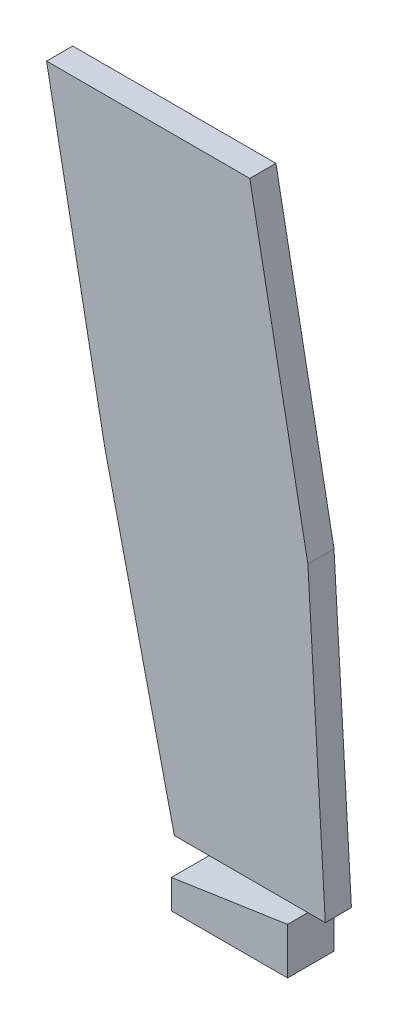
ISO-10303-21;
HEADER;
FILE_DESCRIPTION(('STEP AP214'),'2;1');
FILE_NAME('part.step','',(''),(''),'','','');
FILE_SCHEMA(('AUTOMOTIVE_DESIGN { 1 0 10303 214 1 1 1 1 }'));
ENDSEC;
DATA;
#1=APPLICATION_CONTEXT('core data for automotive mechanical design processes');
#2=APPLICATION_PROTOCOL_DEFINITION('international standard','automotive_design',2000,#1);
#3=PRODUCT_CONTEXT('',#1,'mechanical');
#4=PRODUCT('Part','Part','',(#3));
#5=PRODUCT_RELATED_PRODUCT_CATEGORY('part','',(#4));
#6=PRODUCT_DEFINITION_FORMATION('','',#4);
#7=PRODUCT_DEFINITION_CONTEXT('part definition',#1,'design');
#8=PRODUCT_DEFINITION('design','',#6,#7);
#9=PRODUCT_DEFINITION_SHAPE('','',#8);
#10=(LENGTH_UNIT() NAMED_UNIT(*) SI_UNIT(.MILLI.,.METRE.));
#11=(NAMED_UNIT(*) PLANE_ANGLE_UNIT() SI_UNIT($,.RADIAN.));
#12=(NAMED_UNIT(*) SI_UNIT($,.STERADIAN.) SOLID_ANGLE_UNIT());
#13=UNCERTAINTY_MEASURE_WITH_UNIT(LENGTH_MEASURE(1.E-05),#10,'distance_accuracy_value','');
#14=(GEOMETRIC_REPRESENTATION_CONTEXT(3) GLOBAL_UNCERTAINTY_ASSIGNED_CONTEXT((#13)) GLOBAL_UNIT_ASSIGNED_CONTEXT((#10,
#11,#12)) REPRESENTATION_CONTEXT('',''));
#15=CARTESIAN_POINT('',(0.,0.,0.));
#16=DIRECTION('',(0.,0.,1.));
#17=DIRECTION('',(1.,0.,0.));
#18=AXIS2_PLACEMENT_3D('',#15,#16,#17);
#19=CARTESIAN_POINT('',(1180.,580.,45.));
#20=DIRECTION('',(0.,1.,0.));
#21=DIRECTION('',(0.,0.,1.));
#22=AXIS2_PLACEMENT_3D('',#19,#20,#21);
#23=PLANE('',#22);
#24=DIRECTION('',(1.,0.,0.));
#25=VECTOR('',#24,1.);
#26=CARTESIAN_POINT('',(1180.,580.,0.));
#27=LINE('',#26,#25);
#28=CARTESIAN_POINT('',(920.,580.,0.));
#29=VERTEX_POINT('',#28);
#30=CARTESIAN_POINT('',(1180.,580.,0.));
#31=VERTEX_POINT('',#30);
#32=EDGE_CURVE('E133',#29,#31,#27,.T.);
#33=ORIENTED_EDGE('',*,*,#32,.T.);
#34=DIRECTION('',(0.,0.,-1.));
#35=VECTOR('',#34,1.);
#36=CARTESIAN_POINT('',(1180.,580.,45.));
#37=LINE('',#36,#35);
#38=CARTESIAN_POINT('',(1180.,580.,45.));
#39=VERTEX_POINT('',#38);
#40=EDGE_CURVE('E12',#39,#31,#37,.T.);
#41=ORIENTED_EDGE('',*,*,#40,.F.);
#42=DIRECTION('',(1.,0.,0.));
#43=VECTOR('',#42,1.);
#44=CARTESIAN_POINT('',(1180.,580.,45.));
#45=LINE('',#44,#43);
#46=CARTESIAN_POINT('',(920.,580.,45.));
#47=VERTEX_POINT('',#46);
#48=EDGE_CURVE('E142',#47,#39,#45,.T.);
#49=ORIENTED_EDGE('',*,*,#48,.F.);
#50=DIRECTION('',(0.,0.,-1.));
#51=VECTOR('',#50,1.);
#52=CARTESIAN_POINT('',(920.,580.,45.));
#53=LINE('',#52,#51);
#54=EDGE_CURVE('E129',#47,#29,#53,.T.);
#55=ORIENTED_EDGE('',*,*,#54,.T.);
#56=EDGE_LOOP('',(#33,#41,#49,#55));
#57=FACE_BOUND('',#56,.T.);
#58=ADVANCED_FACE('F47',(#57),#23,.F.);
#59=CARTESIAN_POINT('',(1150.,1100.,45.));
#60=DIRECTION('',(-0.998339941675609,-0.0575965350966698,0.));
#61=DIRECTION('',(0.0575965350966698,-0.998339941675609,0.));
#62=AXIS2_PLACEMENT_3D('',#59,#60,#61);
#63=PLANE('',#62);
#64=DIRECTION('',(-0.0575965350966698,0.998339941675609,0.));
#65=VECTOR('',#64,1.);
#66=CARTESIAN_POINT('',(1150.,1100.,0.));
#67=LINE('',#66,#65);
#68=CARTESIAN_POINT('',(1150.,1100.,0.));
#69=VERTEX_POINT('',#68);
#70=EDGE_CURVE('E136',#31,#69,#67,.T.);
#71=ORIENTED_EDGE('',*,*,#70,.T.);
#72=DIRECTION('',(0.,0.,-1.));
#73=VECTOR('',#72,1.);
#74=CARTESIAN_POINT('',(1150.,1100.,45.));
#75=LINE('',#74,#73);
#76=CARTESIAN_POINT('',(1150.,1100.,45.));
#77=VERTEX_POINT('',#76);
#78=EDGE_CURVE('E60',#77,#69,#75,.T.);
#79=ORIENTED_EDGE('',*,*,#78,.F.);
#80=DIRECTION('',(-0.0575965350966698,0.998339941675609,0.));
#81=VECTOR('',#80,1.);
#82=CARTESIAN_POINT('',(1150.,1100.,45.));
#83=LINE('',#82,#81);
#84=EDGE_CURVE('E105',#39,#77,#83,.T.);
#85=ORIENTED_EDGE('',*,*,#84,.F.);
#86=ORIENTED_EDGE('',*,*,#40,.T.);
#87=EDGE_LOOP('',(#71,#79,#85,#86));
#88=FACE_BOUND('',#87,.T.);
#89=ADVANCED_FACE('F167',(#88),#63,.F.);
#90=CARTESIAN_POINT('',(1050.,1625.,45.));
#91=DIRECTION('',(-0.982338566422475,-0.187112107889995,0.));
#92=DIRECTION('',(0.187112107889995,-0.982338566422475,0.));
#93=AXIS2_PLACEMENT_3D('',#90,#91,#92);
#94=PLANE('',#93);
#95=DIRECTION('',(-0.187112107889995,0.982338566422475,0.));
#96=VECTOR('',#95,1.);
#97=CARTESIAN_POINT('',(1050.,1625.,0.));
#98=LINE('',#97,#96);
#99=CARTESIAN_POINT('',(1050.,1625.,0.));
#100=VERTEX_POINT('',#99);
#101=EDGE_CURVE('E138',#69,#100,#98,.T.);
#102=ORIENTED_EDGE('',*,*,#101,.T.);
#103=DIRECTION('',(0.,0.,-1.));
#104=VECTOR('',#103,1.);
#105=CARTESIAN_POINT('',(1050.,1625.,45.));
#106=LINE('',#105,#104);
#107=CARTESIAN_POINT('',(1050.,1625.,45.));
#108=VERTEX_POINT('',#107);
#109=EDGE_CURVE('E125',#108,#100,#106,.T.);
#110=ORIENTED_EDGE('',*,*,#109,.F.);
#111=DIRECTION('',(-0.187112107889995,0.982338566422475,0.));
#112=VECTOR('',#111,1.);
#113=CARTESIAN_POINT('',(1050.,1625.,45.));
#114=LINE('',#113,#112);
#115=EDGE_CURVE('E113',#77,#108,#114,.T.);
#116=ORIENTED_EDGE('',*,*,#115,.F.);
#117=ORIENTED_EDGE('',*,*,#78,.T.);
#118=EDGE_LOOP('',(#102,#110,#116,#117));
#119=FACE_BOUND('',#118,.T.);
#120=ADVANCED_FACE('F146',(#119),#94,.F.);
#121=CARTESIAN_POINT('',(700.,1625.,45.));
#122=DIRECTION('',(0.,-1.,0.));
#123=DIRECTION('',(0.,0.,-1.));
#124=AXIS2_PLACEMENT_3D('',#121,#122,#123);
#125=PLANE('',#124);
#126=DIRECTION('',(-1.,0.,0.));
#127=VECTOR('',#126,1.);
#128=CARTESIAN_POINT('',(700.,1625.,0.));
#129=LINE('',#128,#127);
#130=CARTESIAN_POINT('',(700.,1625.,0.));
#131=VERTEX_POINT('',#130);
#132=EDGE_CURVE('E121',#100,#131,#129,.T.);
#133=ORIENTED_EDGE('',*,*,#132,.T.);
#134=DIRECTION('',(0.,0.,-1.));
#135=VECTOR('',#134,1.);
#136=CARTESIAN_POINT('',(700.,1625.,45.));
#137=LINE('',#136,#135);
#138=CARTESIAN_POINT('',(700.,1625.,45.));
#139=VERTEX_POINT('',#138);
#140=EDGE_CURVE('E119',#139,#131,#137,.T.);
#141=ORIENTED_EDGE('',*,*,#140,.F.);
#142=DIRECTION('',(-1.,0.,0.));
#143=VECTOR('',#142,1.);
#144=CARTESIAN_POINT('',(700.,1625.,45.));
#145=LINE('',#144,#143);
#146=EDGE_CURVE('E107',#108,#139,#145,.T.);
#147=ORIENTED_EDGE('',*,*,#146,.F.);
#148=ORIENTED_EDGE('',*,*,#109,.T.);
#149=EDGE_LOOP('',(#133,#141,#147,#148));
#150=FACE_BOUND('',#149,.T.);
#151=ADVANCED_FACE('F123',(#150),#125,.F.);
#152=CARTESIAN_POINT('',(800.,1100.,45.));
#153=DIRECTION('',(0.982338566422475,0.187112107889995,0.));
#154=DIRECTION('',(-0.187112107889995,0.982338566422475,0.));
#155=AXIS2_PLACEMENT_3D('',#152,#153,#154);
#156=PLANE('',#155);
#157=DIRECTION('',(0.187112107889995,-0.982338566422475,0.));
#158=VECTOR('',#157,1.);
#159=CARTESIAN_POINT('',(800.,1100.,0.));
#160=LINE('',#159,#158);
#161=CARTESIAN_POINT('',(800.,1100.,0.));
#162=VERTEX_POINT('',#161);
#163=EDGE_CURVE('E88',#131,#162,#160,.T.);
#164=ORIENTED_EDGE('',*,*,#163,.T.);
#165=DIRECTION('',(0.,0.,-1.));
#166=VECTOR('',#165,1.);
#167=CARTESIAN_POINT('',(800.,1100.,45.));
#168=LINE('',#167,#166);
#169=CARTESIAN_POINT('',(800.,1100.,45.));
#170=VERTEX_POINT('',#169);
#171=EDGE_CURVE('E124',#170,#162,#168,.T.);
#172=ORIENTED_EDGE('',*,*,#171,.F.);
#173=DIRECTION('',(0.187112107889995,-0.982338566422475,0.));
#174=VECTOR('',#173,1.);
#175=CARTESIAN_POINT('',(800.,1100.,45.));
#176=LINE('',#175,#174);
#177=EDGE_CURVE('E111',#139,#170,#176,.T.);
#178=ORIENTED_EDGE('',*,*,#177,.F.);
#179=ORIENTED_EDGE('',*,*,#140,.T.);
#180=EDGE_LOOP('',(#164,#172,#178,#179));
#181=FACE_BOUND('',#180,.T.);
#182=ADVANCED_FACE('F130',(#181),#156,.F.);
#183=CARTESIAN_POINT('',(920.,580.,45.));
#184=DIRECTION('',(0.97439119569462,0.224859506698758,0.));
#185=DIRECTION('',(-0.224859506698758,0.97439119569462,0.));
#186=AXIS2_PLACEMENT_3D('',#183,#184,#185);
#187=PLANE('',#186);
#188=DIRECTION('',(0.224859506698758,-0.97439119569462,0.));
#189=VECTOR('',#188,1.);
#190=CARTESIAN_POINT('',(920.,580.,0.));
#191=LINE('',#190,#189);
#192=EDGE_CURVE('E92',#162,#29,#191,.T.);
#193=ORIENTED_EDGE('',*,*,#192,.T.);
#194=ORIENTED_EDGE('',*,*,#54,.F.);
#195=DIRECTION('',(0.224859506698758,-0.97439119569462,0.));
#196=VECTOR('',#195,1.);
#197=CARTESIAN_POINT('',(920.,580.,45.));
#198=LINE('',#197,#196);
#199=EDGE_CURVE('E64',#170,#47,#198,.T.);
#200=ORIENTED_EDGE('',*,*,#199,.F.);
#201=ORIENTED_EDGE('',*,*,#171,.T.);
#202=EDGE_LOOP('',(#193,#194,#200,#201));
#203=FACE_BOUND('',#202,.T.);
#204=ADVANCED_FACE('F157',(#203),#187,.F.);
#205=CARTESIAN_POINT('',(0.,0.,45.));
#206=DIRECTION('',(0.,0.,1.));
#207=DIRECTION('',(1.,0.,0.));
#208=AXIS2_PLACEMENT_3D('',#205,#206,#207);
#209=PLANE('',#208);
#210=ORIENTED_EDGE('',*,*,#48,.T.);
#211=ORIENTED_EDGE('',*,*,#84,.T.);
#212=ORIENTED_EDGE('',*,*,#115,.T.);
#213=ORIENTED_EDGE('',*,*,#146,.T.);
#214=ORIENTED_EDGE('',*,*,#177,.T.);
#215=ORIENTED_EDGE('',*,*,#199,.T.);
#216=EDGE_LOOP('',(#210,#211,#212,#213,#214,#215));
#217=FACE_BOUND('',#216,.T.);
#218=ADVANCED_FACE('F112',(#217),#209,.T.);
#219=CARTESIAN_POINT('',(0.,0.,0.));
#220=DIRECTION('',(0.,0.,1.));
#221=DIRECTION('',(1.,0.,0.));
#222=AXIS2_PLACEMENT_3D('',#219,#220,#221);
#223=PLANE('',#222);
#224=ORIENTED_EDGE('',*,*,#32,.F.);
#225=ORIENTED_EDGE('',*,*,#192,.F.);
#226=ORIENTED_EDGE('',*,*,#163,.F.);
#227=ORIENTED_EDGE('',*,*,#132,.F.);
#228=ORIENTED_EDGE('',*,*,#101,.F.);
#229=ORIENTED_EDGE('',*,*,#70,.F.);
#230=EDGE_LOOP('',(#224,#225,#226,#227,#228,#229));
#231=FACE_BOUND('',#230,.T.);
#232=ADVANCED_FACE('F155',(#231),#223,.F.);
#233=CLOSED_SHELL('',(#58,#89,#120,#151,#182,#204,#218,#232));
#234=MANIFOLD_SOLID_BREP('B2',#233);
#235=CARTESIAN_POINT('',(1150.,500.,80.));
#236=DIRECTION('',(0.,1.,0.));
#237=DIRECTION('',(0.,0.,1.));
#238=AXIS2_PLACEMENT_3D('',#235,#236,#237);
#239=PLANE('',#238);
#240=DIRECTION('',(1.,0.,0.));
#241=VECTOR('',#240,1.);
#242=CARTESIAN_POINT('',(1150.,500.,0.));
#243=LINE('',#242,#241);
#244=CARTESIAN_POINT('',(950.,500.,0.));
#245=VERTEX_POINT('',#244);
#246=CARTESIAN_POINT('',(1150.,500.,0.));
#247=VERTEX_POINT('',#246);
#248=EDGE_CURVE('E286',#245,#247,#243,.T.);
#249=ORIENTED_EDGE('',*,*,#248,.T.);
#250=DIRECTION('',(0.,0.,-1.));
#251=VECTOR('',#250,1.);
#252=CARTESIAN_POINT('',(1150.,500.,80.));
#253=LINE('',#252,#251);
#254=CARTESIAN_POINT('',(1150.,500.,80.));
#255=VERTEX_POINT('',#254);
#256=EDGE_CURVE('E50',#255,#247,#253,.T.);
#257=ORIENTED_EDGE('',*,*,#256,.F.);
#258=DIRECTION('',(1.,0.,0.));
#259=VECTOR('',#258,1.);
#260=CARTESIAN_POINT('',(1150.,500.,80.));
#261=LINE('',#260,#259);
#262=CARTESIAN_POINT('',(950.,500.,80.));
#263=VERTEX_POINT('',#262);
#264=EDGE_CURVE('E274',#263,#255,#261,.T.);
#265=ORIENTED_EDGE('',*,*,#264,.F.);
#266=DIRECTION('',(0.,0.,-1.));
#267=VECTOR('',#266,1.);
#268=CARTESIAN_POINT('',(950.,500.,80.));
#269=LINE('',#268,#267);
#270=EDGE_CURVE('E281',#263,#245,#269,.T.);
#271=ORIENTED_EDGE('',*,*,#270,.T.);
#272=EDGE_LOOP('',(#249,#257,#265,#271));
#273=FACE_BOUND('',#272,.T.);
#274=ADVANCED_FACE('F224',(#273),#239,.F.);
#275=CARTESIAN_POINT('',(1150.,580.,80.));
#276=DIRECTION('',(-1.,0.,0.));
#277=DIRECTION('',(0.,0.,1.));
#278=AXIS2_PLACEMENT_3D('',#275,#276,#277);
#279=PLANE('',#278);
#280=DIRECTION('',(0.,1.,0.));
#281=VECTOR('',#280,1.);
#282=CARTESIAN_POINT('',(1150.,580.,0.));
#283=LINE('',#282,#281);
#284=CARTESIAN_POINT('',(1150.,580.,0.));
#285=VERTEX_POINT('',#284);
#286=EDGE_CURVE('E279',#247,#285,#283,.T.);
#287=ORIENTED_EDGE('',*,*,#286,.T.);
#288=DIRECTION('',(0.,0.,-1.));
#289=VECTOR('',#288,1.);
#290=CARTESIAN_POINT('',(1150.,580.,80.));
#291=LINE('',#290,#289);
#292=CARTESIAN_POINT('',(1150.,580.,80.));
#293=VERTEX_POINT('',#292);
#294=EDGE_CURVE('E232',#293,#285,#291,.T.);
#295=ORIENTED_EDGE('',*,*,#294,.F.);
#296=DIRECTION('',(0.,1.,0.));
#297=VECTOR('',#296,1.);
#298=CARTESIAN_POINT('',(1150.,580.,80.));
#299=LINE('',#298,#297);
#300=EDGE_CURVE('E269',#255,#293,#299,.T.);
#301=ORIENTED_EDGE('',*,*,#300,.F.);
#302=ORIENTED_EDGE('',*,*,#256,.T.);
#303=EDGE_LOOP('',(#287,#295,#301,#302));
#304=FACE_BOUND('',#303,.T.);
#305=ADVANCED_FACE('F278',(#304),#279,.F.);
#306=CARTESIAN_POINT('',(950.,550.,80.));
#307=DIRECTION('',(0.148340452930244,-0.988936352868298,0.));
#308=DIRECTION('',(0.988936352868298,0.148340452930244,0.));
#309=AXIS2_PLACEMENT_3D('',#306,#307,#308);
#310=PLANE('',#309);
#311=DIRECTION('',(-0.988936352868298,-0.148340452930244,0.));
#312=VECTOR('',#311,1.);
#313=CARTESIAN_POINT('',(950.,550.,0.));
#314=LINE('',#313,#312);
#315=CARTESIAN_POINT('',(950.,550.,0.));
#316=VERTEX_POINT('',#315);
#317=EDGE_CURVE('E257',#285,#316,#314,.T.);
#318=ORIENTED_EDGE('',*,*,#317,.T.);
#319=DIRECTION('',(0.,0.,-1.));
#320=VECTOR('',#319,1.);
#321=CARTESIAN_POINT('',(950.,550.,80.));
#322=LINE('',#321,#320);
#323=CARTESIAN_POINT('',(950.,550.,80.));
#324=VERTEX_POINT('',#323);
#325=EDGE_CURVE('E282',#324,#316,#322,.T.);
#326=ORIENTED_EDGE('',*,*,#325,.F.);
#327=DIRECTION('',(-0.988936352868298,-0.148340452930244,0.));
#328=VECTOR('',#327,1.);
#329=CARTESIAN_POINT('',(950.,550.,80.));
#330=LINE('',#329,#328);
#331=EDGE_CURVE('E273',#293,#324,#330,.T.);
#332=ORIENTED_EDGE('',*,*,#331,.F.);
#333=ORIENTED_EDGE('',*,*,#294,.T.);
#334=EDGE_LOOP('',(#318,#326,#332,#333));
#335=FACE_BOUND('',#334,.T.);
#336=ADVANCED_FACE('F285',(#335),#310,.F.);
#337=CARTESIAN_POINT('',(950.,500.,80.));
#338=DIRECTION('',(1.,0.,0.));
#339=DIRECTION('',(0.,0.,-1.));
#340=AXIS2_PLACEMENT_3D('',#337,#338,#339);
#341=PLANE('',#340);
#342=DIRECTION('',(0.,-1.,0.));
#343=VECTOR('',#342,1.);
#344=CARTESIAN_POINT('',(950.,500.,0.));
#345=LINE('',#344,#343);
#346=EDGE_CURVE('E261',#316,#245,#345,.T.);
#347=ORIENTED_EDGE('',*,*,#346,.T.);
#348=ORIENTED_EDGE('',*,*,#270,.F.);
#349=DIRECTION('',(0.,-1.,0.));
#350=VECTOR('',#349,1.);
#351=CARTESIAN_POINT('',(950.,500.,80.));
#352=LINE('',#351,#350);
#353=EDGE_CURVE('E243',#324,#263,#352,.T.);
#354=ORIENTED_EDGE('',*,*,#353,.F.);
#355=ORIENTED_EDGE('',*,*,#325,.T.);
#356=EDGE_LOOP('',(#347,#348,#354,#355));
#357=FACE_BOUND('',#356,.T.);
#358=ADVANCED_FACE('F293',(#357),#341,.F.);
#359=CARTESIAN_POINT('',(0.,0.,80.));
#360=DIRECTION('',(0.,0.,-1.));
#361=DIRECTION('',(-1.,0.,0.));
#362=AXIS2_PLACEMENT_3D('',#359,#360,#361);
#363=PLANE('',#362);
#364=ORIENTED_EDGE('',*,*,#264,.T.);
#365=ORIENTED_EDGE('',*,*,#300,.T.);
#366=ORIENTED_EDGE('',*,*,#331,.T.);
#367=ORIENTED_EDGE('',*,*,#353,.T.);
#368=EDGE_LOOP('',(#364,#365,#366,#367));
#369=FACE_BOUND('',#368,.T.);
#370=ADVANCED_FACE('F271',(#369),#363,.F.);
#371=CARTESIAN_POINT('',(0.,0.,0.));
#372=DIRECTION('',(0.,0.,-1.));
#373=DIRECTION('',(-1.,0.,0.));
#374=AXIS2_PLACEMENT_3D('',#371,#372,#373);
#375=PLANE('',#374);
#376=ORIENTED_EDGE('',*,*,#248,.F.);
#377=ORIENTED_EDGE('',*,*,#346,.F.);
#378=ORIENTED_EDGE('',*,*,#317,.F.);
#379=ORIENTED_EDGE('',*,*,#286,.F.);
#380=EDGE_LOOP('',(#376,#377,#378,#379));
#381=FACE_BOUND('',#380,.T.);
#382=ADVANCED_FACE('F296',(#381),#375,.T.);
#383=CLOSED_SHELL('',(#274,#305,#336,#358,#370,#382));
#384=MANIFOLD_SOLID_BREP('B6',#383);
#385=ADVANCED_BREP_SHAPE_REPRESENTATION('',(#18,#234,#384),#14);
#386=SHAPE_DEFINITION_REPRESENTATION(#9,#385);
ENDSEC;
END-ISO-10303-21;
